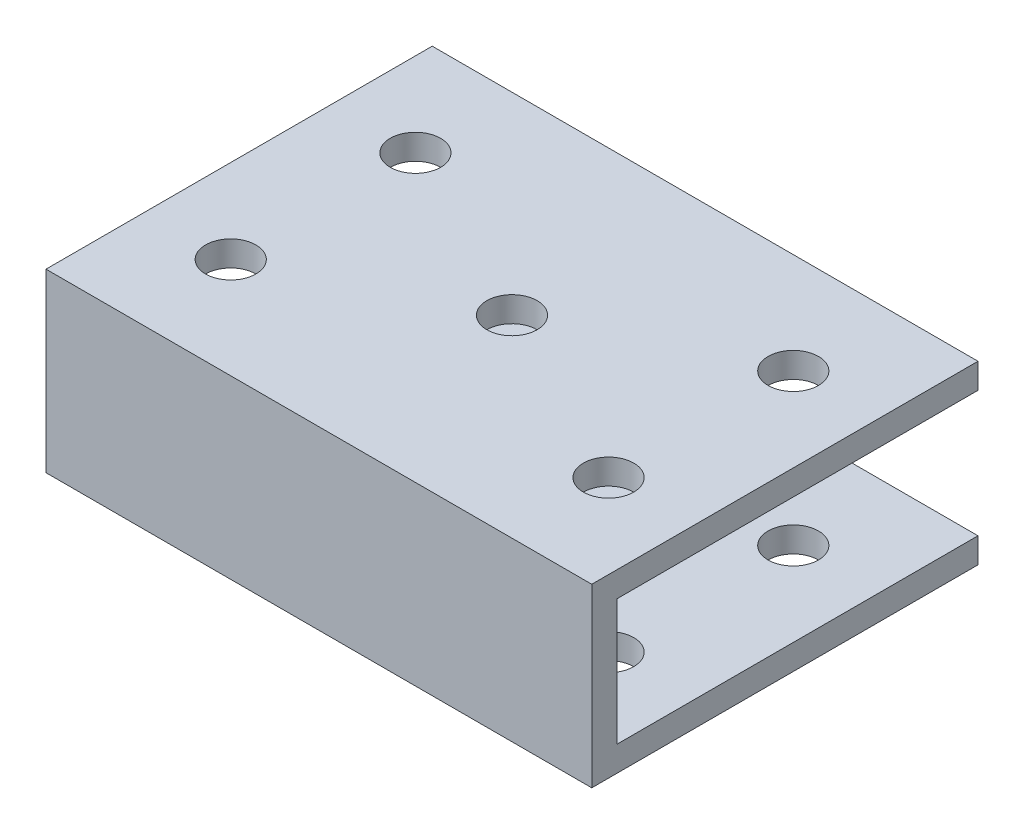
ISO-10303-21;
HEADER;
FILE_DESCRIPTION(('STEP AP214'),'2;1');
FILE_NAME('part.step','',(''),(''),'','','');
FILE_SCHEMA(('AUTOMOTIVE_DESIGN { 1 0 10303 214 1 1 1 1 }'));
ENDSEC;
DATA;
#1=APPLICATION_CONTEXT('core data for automotive mechanical design processes');
#2=APPLICATION_PROTOCOL_DEFINITION('international standard','automotive_design',2000,#1);
#3=PRODUCT_CONTEXT('',#1,'mechanical');
#4=PRODUCT('Part','Part','',(#3));
#5=PRODUCT_RELATED_PRODUCT_CATEGORY('part','',(#4));
#6=PRODUCT_DEFINITION_FORMATION('','',#4);
#7=PRODUCT_DEFINITION_CONTEXT('part definition',#1,'design');
#8=PRODUCT_DEFINITION('design','',#6,#7);
#9=PRODUCT_DEFINITION_SHAPE('','',#8);
#10=(LENGTH_UNIT() NAMED_UNIT(*) SI_UNIT(.MILLI.,.METRE.));
#11=(NAMED_UNIT(*) PLANE_ANGLE_UNIT() SI_UNIT($,.RADIAN.));
#12=(NAMED_UNIT(*) SI_UNIT($,.STERADIAN.) SOLID_ANGLE_UNIT());
#13=UNCERTAINTY_MEASURE_WITH_UNIT(LENGTH_MEASURE(1.E-05),#10,'distance_accuracy_value','');
#14=(GEOMETRIC_REPRESENTATION_CONTEXT(3) GLOBAL_UNCERTAINTY_ASSIGNED_CONTEXT((#13)) GLOBAL_UNIT_ASSIGNED_CONTEXT((#10,
#11,#12)) REPRESENTATION_CONTEXT('',''));
#15=CARTESIAN_POINT('',(0.,0.,0.));
#16=DIRECTION('',(0.,0.,1.));
#17=DIRECTION('',(1.,0.,0.));
#18=AXIS2_PLACEMENT_3D('',#15,#16,#17);
#19=CARTESIAN_POINT('',(0.,3.,0.));
#20=DIRECTION('',(1.,0.,0.));
#21=DIRECTION('',(0.,0.,-1.));
#22=AXIS2_PLACEMENT_3D('',#19,#20,#21);
#23=PLANE('',#22);
#24=DIRECTION('',(0.,0.,1.));
#25=VECTOR('',#24,1.);
#26=CARTESIAN_POINT('',(0.,0.,0.));
#27=LINE('',#26,#25);
#28=CARTESIAN_POINT('',(0.,0.,-46.));
#29=VERTEX_POINT('',#28);
#30=CARTESIAN_POINT('',(0.,0.,0.));
#31=VERTEX_POINT('',#30);
#32=EDGE_CURVE('E93',#29,#31,#27,.T.);
#33=ORIENTED_EDGE('',*,*,#32,.T.);
#34=DIRECTION('',(0.,-1.,0.));
#35=VECTOR('',#34,1.);
#36=CARTESIAN_POINT('',(0.,3.,0.));
#37=LINE('',#36,#35);
#38=CARTESIAN_POINT('',(0.,21.,0.));
#39=VERTEX_POINT('',#38);
#40=EDGE_CURVE('E11',#39,#31,#37,.T.);
#41=ORIENTED_EDGE('',*,*,#40,.F.);
#42=DIRECTION('',(0.,0.,1.));
#43=VECTOR('',#42,1.);
#44=CARTESIAN_POINT('',(0.,21.,0.));
#45=LINE('',#44,#43);
#46=CARTESIAN_POINT('',(0.,21.,-46.));
#47=VERTEX_POINT('',#46);
#48=EDGE_CURVE('E180',#47,#39,#45,.T.);
#49=ORIENTED_EDGE('',*,*,#48,.F.);
#50=DIRECTION('',(0.,-1.,0.));
#51=VECTOR('',#50,1.);
#52=CARTESIAN_POINT('',(0.,21.,-46.));
#53=LINE('',#52,#51);
#54=CARTESIAN_POINT('',(0.,18.,-46.));
#55=VERTEX_POINT('',#54);
#56=EDGE_CURVE('E193',#47,#55,#53,.T.);
#57=ORIENTED_EDGE('',*,*,#56,.T.);
#58=DIRECTION('',(0.,0.,1.));
#59=VECTOR('',#58,1.);
#60=CARTESIAN_POINT('',(0.,18.,0.));
#61=LINE('',#60,#59);
#62=CARTESIAN_POINT('',(0.,18.,-3.));
#63=VERTEX_POINT('',#62);
#64=EDGE_CURVE('E179',#55,#63,#61,.T.);
#65=ORIENTED_EDGE('',*,*,#64,.T.);
#66=DIRECTION('',(0.,-1.,0.));
#67=VECTOR('',#66,1.);
#68=CARTESIAN_POINT('',(0.,3.,-3.));
#69=LINE('',#68,#67);
#70=CARTESIAN_POINT('',(0.,3.,-3.));
#71=VERTEX_POINT('',#70);
#72=EDGE_CURVE('E218',#63,#71,#69,.T.);
#73=ORIENTED_EDGE('',*,*,#72,.T.);
#74=DIRECTION('',(0.,0.,1.));
#75=VECTOR('',#74,1.);
#76=CARTESIAN_POINT('',(0.,3.,0.));
#77=LINE('',#76,#75);
#78=CARTESIAN_POINT('',(0.,3.,-46.));
#79=VERTEX_POINT('',#78);
#80=EDGE_CURVE('E87',#79,#71,#77,.T.);
#81=ORIENTED_EDGE('',*,*,#80,.F.);
#82=DIRECTION('',(0.,-1.,0.));
#83=VECTOR('',#82,1.);
#84=CARTESIAN_POINT('',(0.,3.,-46.));
#85=LINE('',#84,#83);
#86=EDGE_CURVE('E80',#79,#29,#85,.T.);
#87=ORIENTED_EDGE('',*,*,#86,.T.);
#88=EDGE_LOOP('',(#33,#41,#49,#57,#65,#73,#81,#87));
#89=FACE_BOUND('',#88,.T.);
#90=ADVANCED_FACE('F33',(#89),#23,.F.);
#91=CARTESIAN_POINT('',(0.,3.,0.));
#92=DIRECTION('',(0.,0.,-1.));
#93=DIRECTION('',(-1.,0.,0.));
#94=AXIS2_PLACEMENT_3D('',#91,#92,#93);
#95=PLANE('',#94);
#96=DIRECTION('',(1.,0.,0.));
#97=VECTOR('',#96,1.);
#98=CARTESIAN_POINT('',(0.,0.,0.));
#99=LINE('',#98,#97);
#100=CARTESIAN_POINT('',(65.,0.,0.));
#101=VERTEX_POINT('',#100);
#102=EDGE_CURVE('E97',#31,#101,#99,.T.);
#103=ORIENTED_EDGE('',*,*,#102,.T.);
#104=DIRECTION('',(0.,-1.,0.));
#105=VECTOR('',#104,1.);
#106=CARTESIAN_POINT('',(65.,3.,0.));
#107=LINE('',#106,#105);
#108=CARTESIAN_POINT('',(65.,21.,0.));
#109=VERTEX_POINT('',#108);
#110=EDGE_CURVE('E41',#109,#101,#107,.T.);
#111=ORIENTED_EDGE('',*,*,#110,.F.);
#112=DIRECTION('',(1.,0.,0.));
#113=VECTOR('',#112,1.);
#114=CARTESIAN_POINT('',(0.,21.,0.));
#115=LINE('',#114,#113);
#116=EDGE_CURVE('E183',#39,#109,#115,.T.);
#117=ORIENTED_EDGE('',*,*,#116,.F.);
#118=ORIENTED_EDGE('',*,*,#40,.T.);
#119=EDGE_LOOP('',(#103,#111,#117,#118));
#120=FACE_BOUND('',#119,.T.);
#121=ADVANCED_FACE('F246',(#120),#95,.F.);
#122=CARTESIAN_POINT('',(65.,3.,0.));
#123=DIRECTION('',(-1.,0.,0.));
#124=DIRECTION('',(0.,0.,1.));
#125=AXIS2_PLACEMENT_3D('',#122,#123,#124);
#126=PLANE('',#125);
#127=DIRECTION('',(0.,0.,-1.));
#128=VECTOR('',#127,1.);
#129=CARTESIAN_POINT('',(65.,0.,0.));
#130=LINE('',#129,#128);
#131=CARTESIAN_POINT('',(65.,0.,-46.));
#132=VERTEX_POINT('',#131);
#133=EDGE_CURVE('E88',#101,#132,#130,.T.);
#134=ORIENTED_EDGE('',*,*,#133,.T.);
#135=DIRECTION('',(0.,-1.,0.));
#136=VECTOR('',#135,1.);
#137=CARTESIAN_POINT('',(65.,3.,-46.));
#138=LINE('',#137,#136);
#139=CARTESIAN_POINT('',(65.,3.,-46.));
#140=VERTEX_POINT('',#139);
#141=EDGE_CURVE('E83',#140,#132,#138,.T.);
#142=ORIENTED_EDGE('',*,*,#141,.F.);
#143=DIRECTION('',(0.,0.,-1.));
#144=VECTOR('',#143,1.);
#145=CARTESIAN_POINT('',(65.,3.,0.));
#146=LINE('',#145,#144);
#147=CARTESIAN_POINT('',(65.,3.,-3.));
#148=VERTEX_POINT('',#147);
#149=EDGE_CURVE('E112',#148,#140,#146,.T.);
#150=ORIENTED_EDGE('',*,*,#149,.F.);
#151=DIRECTION('',(0.,1.,0.));
#152=VECTOR('',#151,1.);
#153=CARTESIAN_POINT('',(65.,3.,-3.));
#154=LINE('',#153,#152);
#155=CARTESIAN_POINT('',(65.,18.,-3.));
#156=VERTEX_POINT('',#155);
#157=EDGE_CURVE('E49',#148,#156,#154,.T.);
#158=ORIENTED_EDGE('',*,*,#157,.T.);
#159=DIRECTION('',(0.,0.,-1.));
#160=VECTOR('',#159,1.);
#161=CARTESIAN_POINT('',(65.,18.,0.));
#162=LINE('',#161,#160);
#163=CARTESIAN_POINT('',(65.,18.,-46.));
#164=VERTEX_POINT('',#163);
#165=EDGE_CURVE('E201',#156,#164,#162,.T.);
#166=ORIENTED_EDGE('',*,*,#165,.T.);
#167=DIRECTION('',(0.,-1.,0.));
#168=VECTOR('',#167,1.);
#169=CARTESIAN_POINT('',(65.,21.,-46.));
#170=LINE('',#169,#168);
#171=CARTESIAN_POINT('',(65.,21.,-46.));
#172=VERTEX_POINT('',#171);
#173=EDGE_CURVE('E202',#172,#164,#170,.T.);
#174=ORIENTED_EDGE('',*,*,#173,.F.);
#175=DIRECTION('',(0.,0.,-1.));
#176=VECTOR('',#175,1.);
#177=CARTESIAN_POINT('',(65.,21.,0.));
#178=LINE('',#177,#176);
#179=EDGE_CURVE('E187',#109,#172,#178,.T.);
#180=ORIENTED_EDGE('',*,*,#179,.F.);
#181=ORIENTED_EDGE('',*,*,#110,.T.);
#182=EDGE_LOOP('',(#134,#142,#150,#158,#166,#174,#180,#181));
#183=FACE_BOUND('',#182,.T.);
#184=ADVANCED_FACE('F227',(#183),#126,.F.);
#185=CARTESIAN_POINT('',(0.,3.,-46.));
#186=DIRECTION('',(0.,0.,1.));
#187=DIRECTION('',(1.,0.,0.));
#188=AXIS2_PLACEMENT_3D('',#185,#186,#187);
#189=PLANE('',#188);
#190=DIRECTION('',(-1.,0.,0.));
#191=VECTOR('',#190,1.);
#192=CARTESIAN_POINT('',(0.,0.,-46.));
#193=LINE('',#192,#191);
#194=EDGE_CURVE('E77',#132,#29,#193,.T.);
#195=ORIENTED_EDGE('',*,*,#194,.T.);
#196=ORIENTED_EDGE('',*,*,#86,.F.);
#197=DIRECTION('',(-1.,0.,0.));
#198=VECTOR('',#197,1.);
#199=CARTESIAN_POINT('',(0.,3.,-46.));
#200=LINE('',#199,#198);
#201=EDGE_CURVE('E58',#140,#79,#200,.T.);
#202=ORIENTED_EDGE('',*,*,#201,.F.);
#203=ORIENTED_EDGE('',*,*,#141,.T.);
#204=EDGE_LOOP('',(#195,#196,#202,#203));
#205=FACE_BOUND('',#204,.T.);
#206=ADVANCED_FACE('F79',(#205),#189,.F.);
#207=CARTESIAN_POINT('',(0.,3.,0.));
#208=DIRECTION('',(0.,-1.,0.));
#209=DIRECTION('',(0.,0.,-1.));
#210=AXIS2_PLACEMENT_3D('',#207,#208,#209);
#211=PLANE('',#210);
#212=CARTESIAN_POINT('',(10.,3.,-12.));
#213=DIRECTION('',(0.,-1.,0.));
#214=DIRECTION('',(0.,0.,-1.));
#215=AXIS2_PLACEMENT_3D('',#212,#213,#214);
#216=CIRCLE('',#215,3.);
#217=CARTESIAN_POINT('',(10.,3.,-15.));
#218=VERTEX_POINT('',#217);
#219=EDGE_CURVE('E154',#218,#218,#216,.T.);
#220=ORIENTED_EDGE('',*,*,#219,.T.);
#221=EDGE_LOOP('',(#220));
#222=FACE_BOUND('',#221,.T.);
#223=CARTESIAN_POINT('',(10.,3.,-34.));
#224=DIRECTION('',(0.,-1.,0.));
#225=DIRECTION('',(0.,0.,-1.));
#226=AXIS2_PLACEMENT_3D('',#223,#224,#225);
#227=CIRCLE('',#226,3.);
#228=CARTESIAN_POINT('',(10.,3.,-37.));
#229=VERTEX_POINT('',#228);
#230=EDGE_CURVE('E141',#229,#229,#227,.T.);
#231=ORIENTED_EDGE('',*,*,#230,.T.);
#232=EDGE_LOOP('',(#231));
#233=FACE_BOUND('',#232,.T.);
#234=CARTESIAN_POINT('',(55.,3.,-12.));
#235=DIRECTION('',(0.,-1.,0.));
#236=DIRECTION('',(0.,0.,-1.));
#237=AXIS2_PLACEMENT_3D('',#234,#235,#236);
#238=CIRCLE('',#237,3.00000000000001);
#239=CARTESIAN_POINT('',(55.,3.,-15.));
#240=VERTEX_POINT('',#239);
#241=EDGE_CURVE('E137',#240,#240,#238,.T.);
#242=ORIENTED_EDGE('',*,*,#241,.T.);
#243=EDGE_LOOP('',(#242));
#244=FACE_BOUND('',#243,.T.);
#245=CARTESIAN_POINT('',(55.,3.,-34.));
#246=DIRECTION('',(0.,-1.,0.));
#247=DIRECTION('',(0.,0.,-1.));
#248=AXIS2_PLACEMENT_3D('',#245,#246,#247);
#249=CIRCLE('',#248,3.00000000000001);
#250=CARTESIAN_POINT('',(55.,3.,-37.));
#251=VERTEX_POINT('',#250);
#252=EDGE_CURVE('E133',#251,#251,#249,.T.);
#253=ORIENTED_EDGE('',*,*,#252,.T.);
#254=EDGE_LOOP('',(#253));
#255=FACE_BOUND('',#254,.T.);
#256=CARTESIAN_POINT('',(32.5,3.,-23.));
#257=DIRECTION('',(0.,-1.,0.));
#258=DIRECTION('',(0.,0.,-1.));
#259=AXIS2_PLACEMENT_3D('',#256,#257,#258);
#260=CIRCLE('',#259,3.);
#261=CARTESIAN_POINT('',(32.5,3.,-26.));
#262=VERTEX_POINT('',#261);
#263=EDGE_CURVE('E128',#262,#262,#260,.T.);
#264=ORIENTED_EDGE('',*,*,#263,.T.);
#265=EDGE_LOOP('',(#264));
#266=FACE_BOUND('',#265,.T.);
#267=ORIENTED_EDGE('',*,*,#80,.T.);
#268=DIRECTION('',(1.,0.,0.));
#269=VECTOR('',#268,1.);
#270=CARTESIAN_POINT('',(0.,3.,-3.));
#271=LINE('',#270,#269);
#272=EDGE_CURVE('E220',#71,#148,#271,.T.);
#273=ORIENTED_EDGE('',*,*,#272,.T.);
#274=ORIENTED_EDGE('',*,*,#149,.T.);
#275=ORIENTED_EDGE('',*,*,#201,.T.);
#276=EDGE_LOOP('',(#267,#273,#274,#275));
#277=FACE_BOUND('',#276,.T.);
#278=ADVANCED_FACE('F240',(#222,#233,#244,#255,#266,#277),#211,.F.);
#279=CARTESIAN_POINT('',(0.,0.,0.));
#280=DIRECTION('',(0.,-1.,0.));
#281=DIRECTION('',(0.,0.,-1.));
#282=AXIS2_PLACEMENT_3D('',#279,#280,#281);
#283=PLANE('',#282);
#284=CARTESIAN_POINT('',(10.,0.,-12.));
#285=DIRECTION('',(0.,-1.,0.));
#286=DIRECTION('',(0.,0.,-1.));
#287=AXIS2_PLACEMENT_3D('',#284,#285,#286);
#288=CIRCLE('',#287,3.);
#289=CARTESIAN_POINT('',(10.,0.,-15.));
#290=VERTEX_POINT('',#289);
#291=EDGE_CURVE('E358',#290,#290,#288,.T.);
#292=ORIENTED_EDGE('',*,*,#291,.F.);
#293=EDGE_LOOP('',(#292));
#294=FACE_BOUND('',#293,.T.);
#295=CARTESIAN_POINT('',(10.,0.,-34.));
#296=DIRECTION('',(0.,-1.,0.));
#297=DIRECTION('',(0.,0.,1.));
#298=AXIS2_PLACEMENT_3D('',#295,#296,#297);
#299=CIRCLE('',#298,3.);
#300=CARTESIAN_POINT('',(10.,0.,-31.));
#301=VERTEX_POINT('',#300);
#302=EDGE_CURVE('E149',#301,#301,#299,.T.);
#303=ORIENTED_EDGE('',*,*,#302,.F.);
#304=EDGE_LOOP('',(#303));
#305=FACE_BOUND('',#304,.T.);
#306=CARTESIAN_POINT('',(55.,0.,-12.));
#307=DIRECTION('',(0.,-1.,0.));
#308=DIRECTION('',(0.,0.,1.));
#309=AXIS2_PLACEMENT_3D('',#306,#307,#308);
#310=CIRCLE('',#309,3.00000000000001);
#311=CARTESIAN_POINT('',(55.,0.,-9.));
#312=VERTEX_POINT('',#311);
#313=EDGE_CURVE('E146',#312,#312,#310,.T.);
#314=ORIENTED_EDGE('',*,*,#313,.F.);
#315=EDGE_LOOP('',(#314));
#316=FACE_BOUND('',#315,.T.);
#317=CARTESIAN_POINT('',(55.,0.,-34.));
#318=DIRECTION('',(0.,-1.,0.));
#319=DIRECTION('',(0.,0.,-1.));
#320=AXIS2_PLACEMENT_3D('',#317,#318,#319);
#321=CIRCLE('',#320,3.00000000000001);
#322=CARTESIAN_POINT('',(55.,0.,-37.));
#323=VERTEX_POINT('',#322);
#324=EDGE_CURVE('E165',#323,#323,#321,.T.);
#325=ORIENTED_EDGE('',*,*,#324,.F.);
#326=EDGE_LOOP('',(#325));
#327=FACE_BOUND('',#326,.T.);
#328=CARTESIAN_POINT('',(32.5,0.,-23.));
#329=DIRECTION('',(0.,-1.,0.));
#330=DIRECTION('',(0.,0.,-1.));
#331=AXIS2_PLACEMENT_3D('',#328,#329,#330);
#332=CIRCLE('',#331,3.);
#333=CARTESIAN_POINT('',(32.5,0.,-26.));
#334=VERTEX_POINT('',#333);
#335=EDGE_CURVE('E172',#334,#334,#332,.T.);
#336=ORIENTED_EDGE('',*,*,#335,.F.);
#337=EDGE_LOOP('',(#336));
#338=FACE_BOUND('',#337,.T.);
#339=ORIENTED_EDGE('',*,*,#32,.F.);
#340=ORIENTED_EDGE('',*,*,#194,.F.);
#341=ORIENTED_EDGE('',*,*,#133,.F.);
#342=ORIENTED_EDGE('',*,*,#102,.F.);
#343=EDGE_LOOP('',(#339,#340,#341,#342));
#344=FACE_BOUND('',#343,.T.);
#345=ADVANCED_FACE('F96',(#294,#305,#316,#327,#338,#344),#283,.T.);
#346=CARTESIAN_POINT('',(0.,0.,-3.));
#347=DIRECTION('',(0.,0.,-1.));
#348=DIRECTION('',(-1.,0.,0.));
#349=AXIS2_PLACEMENT_3D('',#346,#347,#348);
#350=PLANE('',#349);
#351=ORIENTED_EDGE('',*,*,#72,.F.);
#352=DIRECTION('',(-1.,0.,0.));
#353=VECTOR('',#352,1.);
#354=CARTESIAN_POINT('',(0.,18.,-3.));
#355=LINE('',#354,#353);
#356=EDGE_CURVE('E98',#156,#63,#355,.T.);
#357=ORIENTED_EDGE('',*,*,#356,.F.);
#358=ORIENTED_EDGE('',*,*,#157,.F.);
#359=ORIENTED_EDGE('',*,*,#272,.F.);
#360=EDGE_LOOP('',(#351,#357,#358,#359));
#361=FACE_BOUND('',#360,.T.);
#362=ADVANCED_FACE('F228',(#361),#350,.T.);
#363=CARTESIAN_POINT('',(0.,21.,-46.));
#364=DIRECTION('',(0.,0.,1.));
#365=DIRECTION('',(1.,0.,0.));
#366=AXIS2_PLACEMENT_3D('',#363,#364,#365);
#367=PLANE('',#366);
#368=DIRECTION('',(-1.,0.,0.));
#369=VECTOR('',#368,1.);
#370=CARTESIAN_POINT('',(0.,18.,-46.));
#371=LINE('',#370,#369);
#372=EDGE_CURVE('E184',#164,#55,#371,.T.);
#373=ORIENTED_EDGE('',*,*,#372,.T.);
#374=ORIENTED_EDGE('',*,*,#56,.F.);
#375=DIRECTION('',(-1.,0.,0.));
#376=VECTOR('',#375,1.);
#377=CARTESIAN_POINT('',(0.,21.,-46.));
#378=LINE('',#377,#376);
#379=EDGE_CURVE('E190',#172,#47,#378,.T.);
#380=ORIENTED_EDGE('',*,*,#379,.F.);
#381=ORIENTED_EDGE('',*,*,#173,.T.);
#382=EDGE_LOOP('',(#373,#374,#380,#381));
#383=FACE_BOUND('',#382,.T.);
#384=ADVANCED_FACE('F252',(#383),#367,.F.);
#385=CARTESIAN_POINT('',(0.,21.,0.));
#386=DIRECTION('',(0.,-1.,0.));
#387=DIRECTION('',(0.,0.,-1.));
#388=AXIS2_PLACEMENT_3D('',#385,#386,#387);
#389=PLANE('',#388);
#390=CARTESIAN_POINT('',(10.,21.,-12.));
#391=DIRECTION('',(0.,-1.,0.));
#392=DIRECTION('',(0.,0.,-1.));
#393=AXIS2_PLACEMENT_3D('',#390,#391,#392);
#394=CIRCLE('',#393,3.);
#395=CARTESIAN_POINT('',(10.,21.,-15.));
#396=VERTEX_POINT('',#395);
#397=EDGE_CURVE('E357',#396,#396,#394,.T.);
#398=ORIENTED_EDGE('',*,*,#397,.T.);
#399=EDGE_LOOP('',(#398));
#400=FACE_BOUND('',#399,.T.);
#401=CARTESIAN_POINT('',(10.,21.,-34.));
#402=DIRECTION('',(0.,-1.,0.));
#403=DIRECTION('',(0.,0.,1.));
#404=AXIS2_PLACEMENT_3D('',#401,#402,#403);
#405=CIRCLE('',#404,3.);
#406=CARTESIAN_POINT('',(10.,21.,-31.));
#407=VERTEX_POINT('',#406);
#408=EDGE_CURVE('E142',#407,#407,#405,.T.);
#409=ORIENTED_EDGE('',*,*,#408,.T.);
#410=EDGE_LOOP('',(#409));
#411=FACE_BOUND('',#410,.T.);
#412=CARTESIAN_POINT('',(55.,21.,-12.));
#413=DIRECTION('',(0.,-1.,0.));
#414=DIRECTION('',(0.,0.,1.));
#415=AXIS2_PLACEMENT_3D('',#412,#413,#414);
#416=CIRCLE('',#415,3.00000000000001);
#417=CARTESIAN_POINT('',(55.,21.,-9.));
#418=VERTEX_POINT('',#417);
#419=EDGE_CURVE('E138',#418,#418,#416,.T.);
#420=ORIENTED_EDGE('',*,*,#419,.T.);
#421=EDGE_LOOP('',(#420));
#422=FACE_BOUND('',#421,.T.);
#423=CARTESIAN_POINT('',(55.,21.,-34.));
#424=DIRECTION('',(0.,-1.,0.));
#425=DIRECTION('',(0.,0.,-1.));
#426=AXIS2_PLACEMENT_3D('',#423,#424,#425);
#427=CIRCLE('',#426,3.00000000000001);
#428=CARTESIAN_POINT('',(55.,21.,-37.));
#429=VERTEX_POINT('',#428);
#430=EDGE_CURVE('E134',#429,#429,#427,.T.);
#431=ORIENTED_EDGE('',*,*,#430,.T.);
#432=EDGE_LOOP('',(#431));
#433=FACE_BOUND('',#432,.T.);
#434=CARTESIAN_POINT('',(32.5,21.,-23.));
#435=DIRECTION('',(0.,-1.,0.));
#436=DIRECTION('',(0.,0.,-1.));
#437=AXIS2_PLACEMENT_3D('',#434,#435,#436);
#438=CIRCLE('',#437,3.);
#439=CARTESIAN_POINT('',(32.5,21.,-26.));
#440=VERTEX_POINT('',#439);
#441=EDGE_CURVE('E129',#440,#440,#438,.T.);
#442=ORIENTED_EDGE('',*,*,#441,.T.);
#443=EDGE_LOOP('',(#442));
#444=FACE_BOUND('',#443,.T.);
#445=ORIENTED_EDGE('',*,*,#48,.T.);
#446=ORIENTED_EDGE('',*,*,#116,.T.);
#447=ORIENTED_EDGE('',*,*,#179,.T.);
#448=ORIENTED_EDGE('',*,*,#379,.T.);
#449=EDGE_LOOP('',(#445,#446,#447,#448));
#450=FACE_BOUND('',#449,.T.);
#451=ADVANCED_FACE('F250',(#400,#411,#422,#433,#444,#450),#389,.F.);
#452=CARTESIAN_POINT('',(0.,18.,0.));
#453=DIRECTION('',(0.,-1.,0.));
#454=DIRECTION('',(0.,0.,-1.));
#455=AXIS2_PLACEMENT_3D('',#452,#453,#454);
#456=PLANE('',#455);
#457=CARTESIAN_POINT('',(10.,18.,-12.));
#458=DIRECTION('',(0.,-1.,0.));
#459=DIRECTION('',(0.,0.,-1.));
#460=AXIS2_PLACEMENT_3D('',#457,#458,#459);
#461=CIRCLE('',#460,3.);
#462=CARTESIAN_POINT('',(10.,18.,-15.));
#463=VERTEX_POINT('',#462);
#464=EDGE_CURVE('E36',#463,#463,#461,.T.);
#465=ORIENTED_EDGE('',*,*,#464,.F.);
#466=EDGE_LOOP('',(#465));
#467=FACE_BOUND('',#466,.T.);
#468=CARTESIAN_POINT('',(10.,18.,-34.));
#469=DIRECTION('',(0.,-1.,0.));
#470=DIRECTION('',(0.,0.,-1.));
#471=AXIS2_PLACEMENT_3D('',#468,#469,#470);
#472=CIRCLE('',#471,3.);
#473=CARTESIAN_POINT('',(10.,18.,-37.));
#474=VERTEX_POINT('',#473);
#475=EDGE_CURVE('E139',#474,#474,#472,.T.);
#476=ORIENTED_EDGE('',*,*,#475,.F.);
#477=EDGE_LOOP('',(#476));
#478=FACE_BOUND('',#477,.T.);
#479=CARTESIAN_POINT('',(55.,18.,-12.));
#480=DIRECTION('',(0.,-1.,0.));
#481=DIRECTION('',(0.,0.,-1.));
#482=AXIS2_PLACEMENT_3D('',#479,#480,#481);
#483=CIRCLE('',#482,3.00000000000001);
#484=CARTESIAN_POINT('',(55.,18.,-15.));
#485=VERTEX_POINT('',#484);
#486=EDGE_CURVE('E135',#485,#485,#483,.T.);
#487=ORIENTED_EDGE('',*,*,#486,.F.);
#488=EDGE_LOOP('',(#487));
#489=FACE_BOUND('',#488,.T.);
#490=CARTESIAN_POINT('',(55.,18.,-34.));
#491=DIRECTION('',(0.,-1.,0.));
#492=DIRECTION('',(0.,0.,-1.));
#493=AXIS2_PLACEMENT_3D('',#490,#491,#492);
#494=CIRCLE('',#493,3.00000000000001);
#495=CARTESIAN_POINT('',(55.,18.,-37.));
#496=VERTEX_POINT('',#495);
#497=EDGE_CURVE('E130',#496,#496,#494,.T.);
#498=ORIENTED_EDGE('',*,*,#497,.F.);
#499=EDGE_LOOP('',(#498));
#500=FACE_BOUND('',#499,.T.);
#501=CARTESIAN_POINT('',(32.5,18.,-23.));
#502=DIRECTION('',(0.,-1.,0.));
#503=DIRECTION('',(0.,0.,-1.));
#504=AXIS2_PLACEMENT_3D('',#501,#502,#503);
#505=CIRCLE('',#504,3.);
#506=CARTESIAN_POINT('',(32.5,18.,-26.));
#507=VERTEX_POINT('',#506);
#508=EDGE_CURVE('E125',#507,#507,#505,.T.);
#509=ORIENTED_EDGE('',*,*,#508,.F.);
#510=EDGE_LOOP('',(#509));
#511=FACE_BOUND('',#510,.T.);
#512=ORIENTED_EDGE('',*,*,#165,.F.);
#513=ORIENTED_EDGE('',*,*,#356,.T.);
#514=ORIENTED_EDGE('',*,*,#64,.F.);
#515=ORIENTED_EDGE('',*,*,#372,.F.);
#516=EDGE_LOOP('',(#512,#513,#514,#515));
#517=FACE_BOUND('',#516,.T.);
#518=ADVANCED_FACE('F231',(#467,#478,#489,#500,#511,#517),#456,.T.);
#519=CARTESIAN_POINT('',(32.5,21.,-23.));
#520=DIRECTION('',(0.,-1.,0.));
#521=DIRECTION('',(0.,0.,-1.));
#522=AXIS2_PLACEMENT_3D('',#519,#520,#521);
#523=CYLINDRICAL_SURFACE('',#522,3.);
#524=ORIENTED_EDGE('',*,*,#508,.T.);
#525=EDGE_LOOP('',(#524));
#526=FACE_BOUND('',#525,.T.);
#527=ORIENTED_EDGE('',*,*,#441,.F.);
#528=EDGE_LOOP('',(#527));
#529=FACE_BOUND('',#528,.T.);
#530=ADVANCED_FACE('F295',(#526,#529),#523,.F.);
#531=ORIENTED_EDGE('',*,*,#335,.T.);
#532=EDGE_LOOP('',(#531));
#533=FACE_BOUND('',#532,.T.);
#534=ORIENTED_EDGE('',*,*,#263,.F.);
#535=EDGE_LOOP('',(#534));
#536=FACE_BOUND('',#535,.T.);
#537=ADVANCED_FACE('F292',(#533,#536),#523,.F.);
#538=CARTESIAN_POINT('',(55.,21.,-34.));
#539=DIRECTION('',(0.,-1.,0.));
#540=DIRECTION('',(0.,0.,-1.));
#541=AXIS2_PLACEMENT_3D('',#538,#539,#540);
#542=CYLINDRICAL_SURFACE('',#541,3.00000000000001);
#543=ORIENTED_EDGE('',*,*,#497,.T.);
#544=EDGE_LOOP('',(#543));
#545=FACE_BOUND('',#544,.T.);
#546=ORIENTED_EDGE('',*,*,#430,.F.);
#547=EDGE_LOOP('',(#546));
#548=FACE_BOUND('',#547,.T.);
#549=ADVANCED_FACE('F294',(#545,#548),#542,.F.);
#550=ORIENTED_EDGE('',*,*,#324,.T.);
#551=EDGE_LOOP('',(#550));
#552=FACE_BOUND('',#551,.T.);
#553=ORIENTED_EDGE('',*,*,#252,.F.);
#554=EDGE_LOOP('',(#553));
#555=FACE_BOUND('',#554,.T.);
#556=ADVANCED_FACE('F302',(#552,#555),#542,.F.);
#557=CARTESIAN_POINT('',(55.,21.,-12.));
#558=DIRECTION('',(0.,-1.,0.));
#559=DIRECTION('',(0.,0.,-1.));
#560=AXIS2_PLACEMENT_3D('',#557,#558,#559);
#561=CYLINDRICAL_SURFACE('',#560,3.00000000000001);
#562=ORIENTED_EDGE('',*,*,#486,.T.);
#563=EDGE_LOOP('',(#562));
#564=FACE_BOUND('',#563,.T.);
#565=ORIENTED_EDGE('',*,*,#419,.F.);
#566=EDGE_LOOP('',(#565));
#567=FACE_BOUND('',#566,.T.);
#568=ADVANCED_FACE('F327',(#564,#567),#561,.F.);
#569=ORIENTED_EDGE('',*,*,#313,.T.);
#570=EDGE_LOOP('',(#569));
#571=FACE_BOUND('',#570,.T.);
#572=ORIENTED_EDGE('',*,*,#241,.F.);
#573=EDGE_LOOP('',(#572));
#574=FACE_BOUND('',#573,.T.);
#575=ADVANCED_FACE('F330',(#571,#574),#561,.F.);
#576=CARTESIAN_POINT('',(10.,21.,-34.));
#577=DIRECTION('',(0.,-1.,0.));
#578=DIRECTION('',(0.,0.,-1.));
#579=AXIS2_PLACEMENT_3D('',#576,#577,#578);
#580=CYLINDRICAL_SURFACE('',#579,3.);
#581=ORIENTED_EDGE('',*,*,#475,.T.);
#582=EDGE_LOOP('',(#581));
#583=FACE_BOUND('',#582,.T.);
#584=ORIENTED_EDGE('',*,*,#408,.F.);
#585=EDGE_LOOP('',(#584));
#586=FACE_BOUND('',#585,.T.);
#587=ADVANCED_FACE('F337',(#583,#586),#580,.F.);
#588=ORIENTED_EDGE('',*,*,#302,.T.);
#589=EDGE_LOOP('',(#588));
#590=FACE_BOUND('',#589,.T.);
#591=ORIENTED_EDGE('',*,*,#230,.F.);
#592=EDGE_LOOP('',(#591));
#593=FACE_BOUND('',#592,.T.);
#594=ADVANCED_FACE('F343',(#590,#593),#580,.F.);
#595=CARTESIAN_POINT('',(10.,21.,-12.));
#596=DIRECTION('',(0.,-1.,0.));
#597=DIRECTION('',(0.,0.,-1.));
#598=AXIS2_PLACEMENT_3D('',#595,#596,#597);
#599=CYLINDRICAL_SURFACE('',#598,3.);
#600=ORIENTED_EDGE('',*,*,#464,.T.);
#601=EDGE_LOOP('',(#600));
#602=FACE_BOUND('',#601,.T.);
#603=ORIENTED_EDGE('',*,*,#397,.F.);
#604=EDGE_LOOP('',(#603));
#605=FACE_BOUND('',#604,.T.);
#606=ADVANCED_FACE('F344',(#602,#605),#599,.F.);
#607=ORIENTED_EDGE('',*,*,#291,.T.);
#608=EDGE_LOOP('',(#607));
#609=FACE_BOUND('',#608,.T.);
#610=ORIENTED_EDGE('',*,*,#219,.F.);
#611=EDGE_LOOP('',(#610));
#612=FACE_BOUND('',#611,.T.);
#613=ADVANCED_FACE('F346',(#609,#612),#599,.F.);
#614=CLOSED_SHELL('',(#90,#121,#184,#206,#278,#345,#362,#384,#451,#518,#530,#537,#549,#556,#568,
#575,#587,#594,#606,#613));
#615=MANIFOLD_SOLID_BREP('B2',#614);
#616=ADVANCED_BREP_SHAPE_REPRESENTATION('',(#18,#615),#14);
#617=SHAPE_DEFINITION_REPRESENTATION(#9,#616);
ENDSEC;
END-ISO-10303-21;
